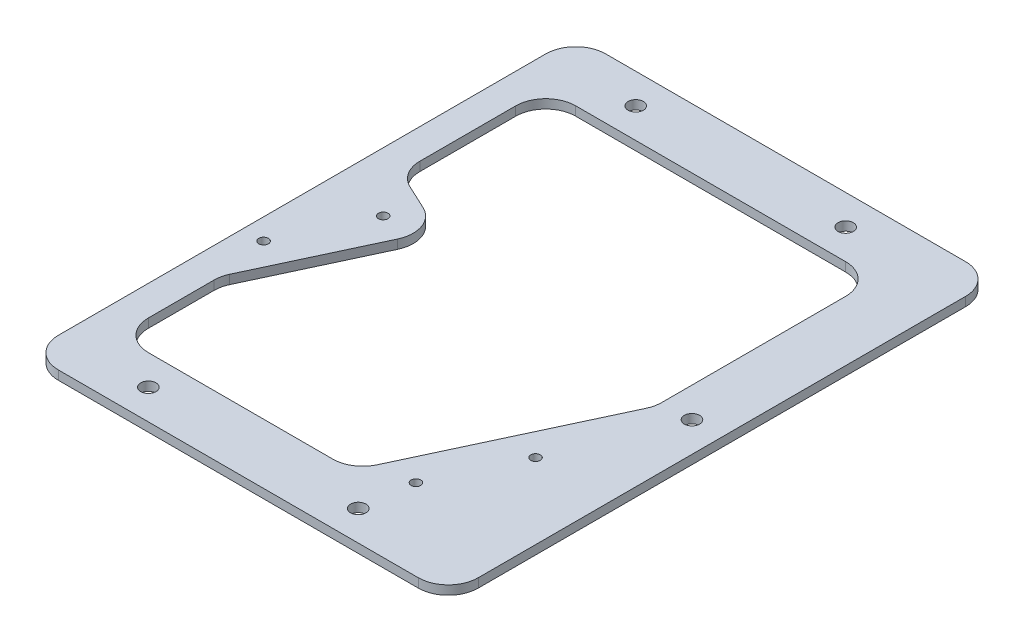
ISO-10303-21;
HEADER;
FILE_DESCRIPTION(('STEP AP214'),'2;1');
FILE_NAME('part.step','',(''),(''),'','','');
FILE_SCHEMA(('AUTOMOTIVE_DESIGN { 1 0 10303 214 1 1 1 1 }'));
ENDSEC;
DATA;
#1=APPLICATION_CONTEXT('core data for automotive mechanical design processes');
#2=APPLICATION_PROTOCOL_DEFINITION('international standard','automotive_design',2000,#1);
#3=PRODUCT_CONTEXT('',#1,'mechanical');
#4=PRODUCT('Part','Part','',(#3));
#5=PRODUCT_RELATED_PRODUCT_CATEGORY('part','',(#4));
#6=PRODUCT_DEFINITION_FORMATION('','',#4);
#7=PRODUCT_DEFINITION_CONTEXT('part definition',#1,'design');
#8=PRODUCT_DEFINITION('design','',#6,#7);
#9=PRODUCT_DEFINITION_SHAPE('','',#8);
#10=(LENGTH_UNIT() NAMED_UNIT(*) SI_UNIT(.MILLI.,.METRE.));
#11=(NAMED_UNIT(*) PLANE_ANGLE_UNIT() SI_UNIT($,.RADIAN.));
#12=(NAMED_UNIT(*) SI_UNIT($,.STERADIAN.) SOLID_ANGLE_UNIT());
#13=UNCERTAINTY_MEASURE_WITH_UNIT(LENGTH_MEASURE(1.E-05),#10,'distance_accuracy_value','');
#14=(GEOMETRIC_REPRESENTATION_CONTEXT(3) GLOBAL_UNCERTAINTY_ASSIGNED_CONTEXT((#13)) GLOBAL_UNIT_ASSIGNED_CONTEXT((#10,
#11,#12)) REPRESENTATION_CONTEXT('',''));
#15=CARTESIAN_POINT('',(0.,0.,0.));
#16=DIRECTION('',(0.,0.,1.));
#17=DIRECTION('',(1.,0.,0.));
#18=AXIS2_PLACEMENT_3D('',#15,#16,#17);
#19=CARTESIAN_POINT('',(0.,3.,0.));
#20=DIRECTION('',(0.,1.,0.));
#21=DIRECTION('',(0.,0.,1.));
#22=AXIS2_PLACEMENT_3D('',#19,#20,#21);
#23=PLANE('',#22);
#24=DIRECTION('',(-0.422618261740701,0.,0.906307787036649));
#25=VECTOR('',#24,1.);
#26=CARTESIAN_POINT('',(-60.,3.,37.0863681859172));
#27=LINE('',#26,#25);
#28=CARTESIAN_POINT('',(-41.2418848933136,3.,-3.14053947608658));
#29=VERTEX_POINT('',#28);
#30=CARTESIAN_POINT('',(-59.0630778703665,3.,35.0771321949396));
#31=VERTEX_POINT('',#30);
#32=EDGE_CURVE('E440',#29,#31,#27,.T.);
#33=ORIENTED_EDGE('',*,*,#32,.F.);
#34=CARTESIAN_POINT('',(-50.3049627636801,3.,-7.3667220934936));
#35=DIRECTION('',(0.,1.,0.));
#36=DIRECTION('',(0.,0.,1.));
#37=AXIS2_PLACEMENT_3D('',#34,#35,#36);
#38=CIRCLE('',#37,10.);
#39=CARTESIAN_POINT('',(-46.0787801462731,3.,-16.4297999638601));
#40=VERTEX_POINT('',#39);
#41=EDGE_CURVE('E320',#29,#40,#38,.T.);
#42=ORIENTED_EDGE('',*,*,#41,.T.);
#43=DIRECTION('',(0.90630778703665,0.,0.422618261740699));
#44=VECTOR('',#43,1.);
#45=CARTESIAN_POINT('',(-37.0157022759066,3.,-12.2036173464531));
#46=LINE('',#45,#44);
#47=CARTESIAN_POINT('',(-54.226182617407,3.,-20.2289961302208));
#48=VERTEX_POINT('',#47);
#49=EDGE_CURVE('E436',#48,#40,#46,.T.);
#50=ORIENTED_EDGE('',*,*,#49,.F.);
#51=CARTESIAN_POINT('',(-50.,3.,-29.2920740005873));
#52=DIRECTION('',(0.,1.,0.));
#53=DIRECTION('',(0.,0.,1.));
#54=AXIS2_PLACEMENT_3D('',#51,#52,#53);
#55=CIRCLE('',#54,10.);
#56=CARTESIAN_POINT('',(-60.0000000000001,3.,-29.2920740005873));
#57=VERTEX_POINT('',#56);
#58=EDGE_CURVE('E370',#48,#57,#55,.F.);
#59=ORIENTED_EDGE('',*,*,#58,.T.);
#60=DIRECTION('',(0.,0.,1.));
#61=VECTOR('',#60,1.);
#62=CARTESIAN_POINT('',(-60.0000000000001,3.,-22.9213713925124));
#63=LINE('',#62,#61);
#64=CARTESIAN_POINT('',(-60.,3.,-61.25));
#65=VERTEX_POINT('',#64);
#66=EDGE_CURVE('E389',#65,#57,#63,.T.);
#67=ORIENTED_EDGE('',*,*,#66,.F.);
#68=CARTESIAN_POINT('',(-50.,3.,-61.25));
#69=DIRECTION('',(0.,1.,0.));
#70=DIRECTION('',(0.,0.,1.));
#71=AXIS2_PLACEMENT_3D('',#68,#69,#70);
#72=CIRCLE('',#71,10.);
#73=CARTESIAN_POINT('',(-50.,3.,-71.25));
#74=VERTEX_POINT('',#73);
#75=EDGE_CURVE('E49',#65,#74,#72,.F.);
#76=ORIENTED_EDGE('',*,*,#75,.T.);
#77=DIRECTION('',(-1.,0.,0.));
#78=VECTOR('',#77,1.);
#79=CARTESIAN_POINT('',(-60.,3.,-71.25));
#80=LINE('',#79,#78);
#81=CARTESIAN_POINT('',(40.,3.,-71.25));
#82=VERTEX_POINT('',#81);
#83=EDGE_CURVE('E388',#82,#74,#80,.T.);
#84=ORIENTED_EDGE('',*,*,#83,.F.);
#85=CARTESIAN_POINT('',(40.,3.,-61.25));
#86=DIRECTION('',(0.,1.,0.));
#87=DIRECTION('',(0.,0.,1.));
#88=AXIS2_PLACEMENT_3D('',#85,#86,#87);
#89=CIRCLE('',#88,10.);
#90=CARTESIAN_POINT('',(50.,3.,-61.25));
#91=VERTEX_POINT('',#90);
#92=EDGE_CURVE('E376',#82,#91,#89,.F.);
#93=ORIENTED_EDGE('',*,*,#92,.T.);
#94=DIRECTION('',(0.,0.,-1.));
#95=VECTOR('',#94,1.);
#96=CARTESIAN_POINT('',(50.,3.,-71.25));
#97=LINE('',#96,#95);
#98=CARTESIAN_POINT('',(50.,3.,0.100794871398885));
#99=VERTEX_POINT('',#98);
#100=EDGE_CURVE('E399',#99,#91,#97,.T.);
#101=ORIENTED_EDGE('',*,*,#100,.F.);
#102=CARTESIAN_POINT('',(40.,3.,0.100794871398885));
#103=DIRECTION('',(0.,1.,0.));
#104=DIRECTION('',(0.,0.,1.));
#105=AXIS2_PLACEMENT_3D('',#102,#103,#104);
#106=CIRCLE('',#105,10.);
#107=CARTESIAN_POINT('',(49.0630778703665,3.,4.32697748880589));
#108=VERTEX_POINT('',#107);
#109=EDGE_CURVE('E346',#99,#108,#106,.F.);
#110=ORIENTED_EDGE('',*,*,#109,.T.);
#111=DIRECTION('',(0.422618261740701,0.,-0.906307787036649));
#112=VECTOR('',#111,1.);
#113=CARTESIAN_POINT('',(50.,3.,2.3177414978283));
#114=LINE('',#113,#112);
#115=CARTESIAN_POINT('',(20.5487352288088,3.,65.476182617407));
#116=VERTEX_POINT('',#115);
#117=EDGE_CURVE('E452',#116,#108,#114,.T.);
#118=ORIENTED_EDGE('',*,*,#117,.F.);
#119=CARTESIAN_POINT('',(11.4856573584423,3.,61.25));
#120=DIRECTION('',(0.,1.,0.));
#121=DIRECTION('',(0.,0.,1.));
#122=AXIS2_PLACEMENT_3D('',#119,#120,#121);
#123=CIRCLE('',#122,10.);
#124=CARTESIAN_POINT('',(11.4856573584423,3.,71.25));
#125=VERTEX_POINT('',#124);
#126=EDGE_CURVE('E352',#116,#125,#123,.F.);
#127=ORIENTED_EDGE('',*,*,#126,.T.);
#128=DIRECTION('',(1.,0.,0.));
#129=VECTOR('',#128,1.);
#130=CARTESIAN_POINT('',(17.8563599665172,3.,71.25));
#131=LINE('',#130,#129);
#132=CARTESIAN_POINT('',(-50.,3.,71.25));
#133=VERTEX_POINT('',#132);
#134=EDGE_CURVE('E448',#133,#125,#131,.T.);
#135=ORIENTED_EDGE('',*,*,#134,.F.);
#136=CARTESIAN_POINT('',(-50.,3.,61.25));
#137=DIRECTION('',(0.,1.,0.));
#138=DIRECTION('',(0.,0.,1.));
#139=AXIS2_PLACEMENT_3D('',#136,#137,#138);
#140=CIRCLE('',#139,10.);
#141=CARTESIAN_POINT('',(-60.0000000000001,3.,61.25));
#142=VERTEX_POINT('',#141);
#143=EDGE_CURVE('E358',#133,#142,#140,.F.);
#144=ORIENTED_EDGE('',*,*,#143,.T.);
#145=DIRECTION('',(0.,0.,1.));
#146=VECTOR('',#145,1.);
#147=CARTESIAN_POINT('',(-60.0000000000001,3.,71.25));
#148=LINE('',#147,#146);
#149=CARTESIAN_POINT('',(-60.,3.,39.3033148123466));
#150=VERTEX_POINT('',#149);
#151=EDGE_CURVE('E444',#150,#142,#148,.T.);
#152=ORIENTED_EDGE('',*,*,#151,.F.);
#153=CARTESIAN_POINT('',(-50.,3.,39.3033148123466));
#154=DIRECTION('',(0.,1.,0.));
#155=DIRECTION('',(0.,0.,1.));
#156=AXIS2_PLACEMENT_3D('',#153,#154,#155);
#157=CIRCLE('',#156,10.);
#158=EDGE_CURVE('E364',#150,#31,#157,.F.);
#159=ORIENTED_EDGE('',*,*,#158,.T.);
#160=EDGE_LOOP('',(#33,#42,#50,#59,#67,#76,#84,#93,#101,#110,#118,#127,#135,#144,#152,#159));
#161=FACE_BOUND('',#160,.T.);
#162=CARTESIAN_POINT('',(-62.9835106159011,3.,19.8225115176058));
#163=DIRECTION('',(0.,1.,0.));
#164=DIRECTION('',(0.,0.,1.));
#165=AXIS2_PLACEMENT_3D('',#162,#163,#164);
#166=CIRCLE('',#165,1.6);
#167=CARTESIAN_POINT('',(-62.9835106159011,3.,21.4225115176058));
#168=VERTEX_POINT('',#167);
#169=EDGE_CURVE('E464',#168,#168,#166,.T.);
#170=ORIENTED_EDGE('',*,*,#169,.F.);
#171=EDGE_LOOP('',(#170));
#172=FACE_BOUND('',#171,.T.);
#173=CARTESIAN_POINT('',(-50.3049627636801,3.,-7.36672209349361));
#174=DIRECTION('',(0.,1.,0.));
#175=DIRECTION('',(0.,0.,1.));
#176=AXIS2_PLACEMENT_3D('',#173,#174,#175);
#177=CIRCLE('',#176,1.60000000000006);
#178=CARTESIAN_POINT('',(-50.3049627636801,3.,-5.76672209349355));
#179=VERTEX_POINT('',#178);
#180=EDGE_CURVE('E472',#179,#179,#177,.T.);
#181=ORIENTED_EDGE('',*,*,#180,.F.);
#182=EDGE_LOOP('',(#181));
#183=FACE_BOUND('',#182,.T.);
#184=CARTESIAN_POINT('',(44.8573548751681,3.,37.0081953892799));
#185=DIRECTION('',(0.,1.,0.));
#186=DIRECTION('',(0.,0.,1.));
#187=AXIS2_PLACEMENT_3D('',#184,#185,#186);
#188=CIRCLE('',#187,1.60000000000003);
#189=CARTESIAN_POINT('',(44.8573548751681,3.,38.60819538928));
#190=VERTEX_POINT('',#189);
#191=EDGE_CURVE('E480',#190,#190,#188,.T.);
#192=ORIENTED_EDGE('',*,*,#191,.F.);
#193=EDGE_LOOP('',(#192));
#194=FACE_BOUND('',#193,.T.);
#195=CARTESIAN_POINT('',(32.1788070229471,3.,64.1974290003794));
#196=DIRECTION('',(0.,1.,0.));
#197=DIRECTION('',(0.,0.,1.));
#198=AXIS2_PLACEMENT_3D('',#195,#196,#197);
#199=CIRCLE('',#198,1.59999999999999);
#200=CARTESIAN_POINT('',(32.1788070229471,3.,65.7974290003794));
#201=VERTEX_POINT('',#200);
#202=EDGE_CURVE('E433',#201,#201,#199,.T.);
#203=ORIENTED_EDGE('',*,*,#202,.F.);
#204=EDGE_LOOP('',(#203));
#205=FACE_BOUND('',#204,.T.);
#206=CARTESIAN_POINT('',(-40.,3.,81.25));
#207=DIRECTION('',(0.,1.,0.));
#208=DIRECTION('',(0.,0.,1.));
#209=AXIS2_PLACEMENT_3D('',#206,#207,#208);
#210=CIRCLE('',#209,2.55);
#211=CARTESIAN_POINT('',(-40.,3.,83.8));
#212=VERTEX_POINT('',#211);
#213=EDGE_CURVE('E499',#212,#212,#210,.T.);
#214=ORIENTED_EDGE('',*,*,#213,.F.);
#215=EDGE_LOOP('',(#214));
#216=FACE_BOUND('',#215,.T.);
#217=CARTESIAN_POINT('',(30.,3.,-81.25));
#218=DIRECTION('',(0.,1.,0.));
#219=DIRECTION('',(0.,0.,1.));
#220=AXIS2_PLACEMENT_3D('',#217,#218,#219);
#221=CIRCLE('',#220,2.55);
#222=CARTESIAN_POINT('',(30.,3.,-78.7));
#223=VERTEX_POINT('',#222);
#224=EDGE_CURVE('E515',#223,#223,#221,.T.);
#225=ORIENTED_EDGE('',*,*,#224,.F.);
#226=EDGE_LOOP('',(#225));
#227=FACE_BOUND('',#226,.T.);
#228=DIRECTION('',(-1.,0.,0.));
#229=VECTOR('',#228,1.);
#230=CARTESIAN_POINT('',(-70.,3.,-91.25));
#231=LINE('',#230,#229);
#232=CARTESIAN_POINT('',(60.,3.,-91.25));
#233=VERTEX_POINT('',#232);
#234=CARTESIAN_POINT('',(-60.,3.,-91.25));
#235=VERTEX_POINT('',#234);
#236=EDGE_CURVE('E533',#233,#235,#231,.T.);
#237=ORIENTED_EDGE('',*,*,#236,.T.);
#238=CARTESIAN_POINT('',(-60.,3.,-81.25));
#239=DIRECTION('',(0.,1.,0.));
#240=DIRECTION('',(0.,0.,1.));
#241=AXIS2_PLACEMENT_3D('',#238,#239,#240);
#242=CIRCLE('',#241,10.);
#243=CARTESIAN_POINT('',(-70.,3.,-81.25));
#244=VERTEX_POINT('',#243);
#245=EDGE_CURVE('E268',#235,#244,#242,.T.);
#246=ORIENTED_EDGE('',*,*,#245,.T.);
#247=DIRECTION('',(0.,0.,1.));
#248=VECTOR('',#247,1.);
#249=CARTESIAN_POINT('',(-70.,3.,-91.25));
#250=LINE('',#249,#248);
#251=CARTESIAN_POINT('',(-70.,3.,81.2499999999999));
#252=VERTEX_POINT('',#251);
#253=EDGE_CURVE('E223',#244,#252,#250,.T.);
#254=ORIENTED_EDGE('',*,*,#253,.T.);
#255=CARTESIAN_POINT('',(-60.,3.,81.25));
#256=DIRECTION('',(0.,1.,0.));
#257=DIRECTION('',(0.,0.,1.));
#258=AXIS2_PLACEMENT_3D('',#255,#256,#257);
#259=CIRCLE('',#258,10.);
#260=CARTESIAN_POINT('',(-60.,3.,91.25));
#261=VERTEX_POINT('',#260);
#262=EDGE_CURVE('E262',#252,#261,#259,.T.);
#263=ORIENTED_EDGE('',*,*,#262,.T.);
#264=DIRECTION('',(1.,0.,0.));
#265=VECTOR('',#264,1.);
#266=CARTESIAN_POINT('',(-70.,3.,91.25));
#267=LINE('',#266,#265);
#268=CARTESIAN_POINT('',(60.,3.,91.25));
#269=VERTEX_POINT('',#268);
#270=EDGE_CURVE('E246',#261,#269,#267,.T.);
#271=ORIENTED_EDGE('',*,*,#270,.T.);
#272=CARTESIAN_POINT('',(60.,3.,81.25));
#273=DIRECTION('',(0.,1.,0.));
#274=DIRECTION('',(0.,0.,1.));
#275=AXIS2_PLACEMENT_3D('',#272,#273,#274);
#276=CIRCLE('',#275,10.);
#277=CARTESIAN_POINT('',(70.,3.,81.2499999999999));
#278=VERTEX_POINT('',#277);
#279=EDGE_CURVE('E259',#269,#278,#276,.T.);
#280=ORIENTED_EDGE('',*,*,#279,.T.);
#281=DIRECTION('',(0.,0.,-1.));
#282=VECTOR('',#281,1.);
#283=CARTESIAN_POINT('',(70.,3.,-91.25));
#284=LINE('',#283,#282);
#285=CARTESIAN_POINT('',(70.,3.,-81.25));
#286=VERTEX_POINT('',#285);
#287=EDGE_CURVE('E239',#278,#286,#284,.T.);
#288=ORIENTED_EDGE('',*,*,#287,.T.);
#289=CARTESIAN_POINT('',(60.,3.,-81.25));
#290=DIRECTION('',(0.,1.,0.));
#291=DIRECTION('',(0.,0.,1.));
#292=AXIS2_PLACEMENT_3D('',#289,#290,#291);
#293=CIRCLE('',#292,10.);
#294=EDGE_CURVE('E265',#286,#233,#293,.T.);
#295=ORIENTED_EDGE('',*,*,#294,.T.);
#296=EDGE_LOOP('',(#237,#246,#254,#263,#271,#280,#288,#295));
#297=FACE_BOUND('',#296,.T.);
#298=CARTESIAN_POINT('',(-40.,3.,-81.25));
#299=DIRECTION('',(0.,1.,0.));
#300=DIRECTION('',(0.,0.,1.));
#301=AXIS2_PLACEMENT_3D('',#298,#299,#300);
#302=CIRCLE('',#301,2.55);
#303=CARTESIAN_POINT('',(-40.,3.,-78.7));
#304=VERTEX_POINT('',#303);
#305=EDGE_CURVE('E523',#304,#304,#302,.T.);
#306=ORIENTED_EDGE('',*,*,#305,.F.);
#307=EDGE_LOOP('',(#306));
#308=FACE_BOUND('',#307,.T.);
#309=CARTESIAN_POINT('',(60.,3.,0.));
#310=DIRECTION('',(0.,1.,0.));
#311=DIRECTION('',(0.,0.,1.));
#312=AXIS2_PLACEMENT_3D('',#309,#310,#311);
#313=CIRCLE('',#312,2.55);
#314=CARTESIAN_POINT('',(60.,3.,2.54999999999997));
#315=VERTEX_POINT('',#314);
#316=EDGE_CURVE('E507',#315,#315,#313,.T.);
#317=ORIENTED_EDGE('',*,*,#316,.F.);
#318=EDGE_LOOP('',(#317));
#319=FACE_BOUND('',#318,.T.);
#320=CARTESIAN_POINT('',(30.,3.,81.25));
#321=DIRECTION('',(0.,1.,0.));
#322=DIRECTION('',(0.,0.,1.));
#323=AXIS2_PLACEMENT_3D('',#320,#321,#322);
#324=CIRCLE('',#323,2.55);
#325=CARTESIAN_POINT('',(30.,3.,83.8));
#326=VERTEX_POINT('',#325);
#327=EDGE_CURVE('E491',#326,#326,#324,.T.);
#328=ORIENTED_EDGE('',*,*,#327,.F.);
#329=EDGE_LOOP('',(#328));
#330=FACE_BOUND('',#329,.T.);
#331=ADVANCED_FACE('F40',(#161,#172,#183,#194,#205,#216,#227,#297,#308,#319,#330),#23,.T.);
#332=CARTESIAN_POINT('',(0.,0.,0.));
#333=DIRECTION('',(0.,1.,0.));
#334=DIRECTION('',(0.,0.,1.));
#335=AXIS2_PLACEMENT_3D('',#332,#333,#334);
#336=PLANE('',#335);
#337=DIRECTION('',(0.90630778703665,0.,0.422618261740699));
#338=VECTOR('',#337,1.);
#339=CARTESIAN_POINT('',(-37.0157022759066,0.,-12.2036173464531));
#340=LINE('',#339,#338);
#341=CARTESIAN_POINT('',(-54.226182617407,0.,-20.2289961302208));
#342=VERTEX_POINT('',#341);
#343=CARTESIAN_POINT('',(-46.0787801462731,0.,-16.4297999638601));
#344=VERTEX_POINT('',#343);
#345=EDGE_CURVE('E404',#342,#344,#340,.T.);
#346=ORIENTED_EDGE('',*,*,#345,.T.);
#347=CARTESIAN_POINT('',(-50.3049627636801,0.,-7.3667220934936));
#348=DIRECTION('',(0.,1.,0.));
#349=DIRECTION('',(0.,0.,1.));
#350=AXIS2_PLACEMENT_3D('',#347,#348,#349);
#351=CIRCLE('',#350,10.);
#352=CARTESIAN_POINT('',(-41.2418848933136,0.,-3.14053947608658));
#353=VERTEX_POINT('',#352);
#354=EDGE_CURVE('E330',#344,#353,#351,.F.);
#355=ORIENTED_EDGE('',*,*,#354,.T.);
#356=DIRECTION('',(-0.422618261740701,0.,0.906307787036649));
#357=VECTOR('',#356,1.);
#358=CARTESIAN_POINT('',(-60.,0.,37.0863681859172));
#359=LINE('',#358,#357);
#360=CARTESIAN_POINT('',(-59.0630778703665,0.,35.0771321949396));
#361=VERTEX_POINT('',#360);
#362=EDGE_CURVE('E408',#353,#361,#359,.T.);
#363=ORIENTED_EDGE('',*,*,#362,.T.);
#364=CARTESIAN_POINT('',(-50.,0.,39.3033148123466));
#365=DIRECTION('',(0.,1.,0.));
#366=DIRECTION('',(0.,0.,1.));
#367=AXIS2_PLACEMENT_3D('',#364,#365,#366);
#368=CIRCLE('',#367,10.);
#369=CARTESIAN_POINT('',(-60.,0.,39.3033148123466));
#370=VERTEX_POINT('',#369);
#371=EDGE_CURVE('E367',#361,#370,#368,.T.);
#372=ORIENTED_EDGE('',*,*,#371,.T.);
#373=DIRECTION('',(0.,0.,1.));
#374=VECTOR('',#373,1.);
#375=CARTESIAN_POINT('',(-60.0000000000001,0.,71.25));
#376=LINE('',#375,#374);
#377=CARTESIAN_POINT('',(-60.0000000000001,0.,61.25));
#378=VERTEX_POINT('',#377);
#379=EDGE_CURVE('E414',#370,#378,#376,.T.);
#380=ORIENTED_EDGE('',*,*,#379,.T.);
#381=CARTESIAN_POINT('',(-50.,0.,61.25));
#382=DIRECTION('',(0.,1.,0.));
#383=DIRECTION('',(0.,0.,1.));
#384=AXIS2_PLACEMENT_3D('',#381,#382,#383);
#385=CIRCLE('',#384,10.);
#386=CARTESIAN_POINT('',(-50.,0.,71.25));
#387=VERTEX_POINT('',#386);
#388=EDGE_CURVE('E361',#378,#387,#385,.T.);
#389=ORIENTED_EDGE('',*,*,#388,.T.);
#390=DIRECTION('',(1.,0.,0.));
#391=VECTOR('',#390,1.);
#392=CARTESIAN_POINT('',(17.8563599665172,0.,71.25));
#393=LINE('',#392,#391);
#394=CARTESIAN_POINT('',(11.4856573584423,0.,71.25));
#395=VERTEX_POINT('',#394);
#396=EDGE_CURVE('E418',#387,#395,#393,.T.);
#397=ORIENTED_EDGE('',*,*,#396,.T.);
#398=CARTESIAN_POINT('',(11.4856573584423,0.,61.25));
#399=DIRECTION('',(0.,1.,0.));
#400=DIRECTION('',(0.,0.,1.));
#401=AXIS2_PLACEMENT_3D('',#398,#399,#400);
#402=CIRCLE('',#401,10.);
#403=CARTESIAN_POINT('',(20.5487352288088,0.,65.476182617407));
#404=VERTEX_POINT('',#403);
#405=EDGE_CURVE('E355',#395,#404,#402,.T.);
#406=ORIENTED_EDGE('',*,*,#405,.T.);
#407=DIRECTION('',(0.422618261740701,0.,-0.906307787036649));
#408=VECTOR('',#407,1.);
#409=CARTESIAN_POINT('',(50.,0.,2.3177414978283));
#410=LINE('',#409,#408);
#411=CARTESIAN_POINT('',(49.0630778703665,0.,4.32697748880589));
#412=VERTEX_POINT('',#411);
#413=EDGE_CURVE('E422',#404,#412,#410,.T.);
#414=ORIENTED_EDGE('',*,*,#413,.T.);
#415=CARTESIAN_POINT('',(40.,0.,0.100794871398885));
#416=DIRECTION('',(0.,1.,0.));
#417=DIRECTION('',(0.,0.,1.));
#418=AXIS2_PLACEMENT_3D('',#415,#416,#417);
#419=CIRCLE('',#418,10.);
#420=CARTESIAN_POINT('',(50.,0.,0.100794871398885));
#421=VERTEX_POINT('',#420);
#422=EDGE_CURVE('E349',#412,#421,#419,.T.);
#423=ORIENTED_EDGE('',*,*,#422,.T.);
#424=DIRECTION('',(0.,0.,-1.));
#425=VECTOR('',#424,1.);
#426=CARTESIAN_POINT('',(50.,0.,-71.25));
#427=LINE('',#426,#425);
#428=CARTESIAN_POINT('',(50.,0.,-61.25));
#429=VERTEX_POINT('',#428);
#430=EDGE_CURVE('E426',#421,#429,#427,.T.);
#431=ORIENTED_EDGE('',*,*,#430,.T.);
#432=CARTESIAN_POINT('',(40.,0.,-61.25));
#433=DIRECTION('',(0.,1.,0.));
#434=DIRECTION('',(0.,0.,1.));
#435=AXIS2_PLACEMENT_3D('',#432,#433,#434);
#436=CIRCLE('',#435,10.);
#437=CARTESIAN_POINT('',(40.,0.,-71.25));
#438=VERTEX_POINT('',#437);
#439=EDGE_CURVE('E379',#429,#438,#436,.T.);
#440=ORIENTED_EDGE('',*,*,#439,.T.);
#441=DIRECTION('',(-1.,0.,0.));
#442=VECTOR('',#441,1.);
#443=CARTESIAN_POINT('',(-60.,0.,-71.25));
#444=LINE('',#443,#442);
#445=CARTESIAN_POINT('',(-50.,0.,-71.25));
#446=VERTEX_POINT('',#445);
#447=EDGE_CURVE('E430',#438,#446,#444,.T.);
#448=ORIENTED_EDGE('',*,*,#447,.T.);
#449=CARTESIAN_POINT('',(-50.,0.,-61.25));
#450=DIRECTION('',(0.,1.,0.));
#451=DIRECTION('',(0.,0.,1.));
#452=AXIS2_PLACEMENT_3D('',#449,#450,#451);
#453=CIRCLE('',#452,10.);
#454=CARTESIAN_POINT('',(-60.,0.,-61.25));
#455=VERTEX_POINT('',#454);
#456=EDGE_CURVE('E11',#446,#455,#453,.T.);
#457=ORIENTED_EDGE('',*,*,#456,.T.);
#458=DIRECTION('',(0.,0.,1.));
#459=VECTOR('',#458,1.);
#460=CARTESIAN_POINT('',(-60.0000000000001,0.,-22.9213713925124));
#461=LINE('',#460,#459);
#462=CARTESIAN_POINT('',(-60.0000000000001,0.,-29.2920740005873));
#463=VERTEX_POINT('',#462);
#464=EDGE_CURVE('E398',#455,#463,#461,.T.);
#465=ORIENTED_EDGE('',*,*,#464,.T.);
#466=CARTESIAN_POINT('',(-50.,0.,-29.2920740005873));
#467=DIRECTION('',(0.,1.,0.));
#468=DIRECTION('',(0.,0.,1.));
#469=AXIS2_PLACEMENT_3D('',#466,#467,#468);
#470=CIRCLE('',#469,10.);
#471=EDGE_CURVE('E373',#463,#342,#470,.T.);
#472=ORIENTED_EDGE('',*,*,#471,.T.);
#473=EDGE_LOOP('',(#346,#355,#363,#372,#380,#389,#397,#406,#414,#423,#431,#440,#448,#457,#465,#472));
#474=FACE_BOUND('',#473,.T.);
#475=CARTESIAN_POINT('',(-62.9835106159011,0.,19.8225115176058));
#476=DIRECTION('',(0.,1.,0.));
#477=DIRECTION('',(0.,0.,1.));
#478=AXIS2_PLACEMENT_3D('',#475,#476,#477);
#479=CIRCLE('',#478,1.6);
#480=CARTESIAN_POINT('',(-62.9835106159011,0.,21.4225115176058));
#481=VERTEX_POINT('',#480);
#482=EDGE_CURVE('E459',#481,#481,#479,.T.);
#483=ORIENTED_EDGE('',*,*,#482,.T.);
#484=EDGE_LOOP('',(#483));
#485=FACE_BOUND('',#484,.T.);
#486=CARTESIAN_POINT('',(-50.3049627636801,0.,-7.36672209349361));
#487=DIRECTION('',(0.,1.,0.));
#488=DIRECTION('',(0.,0.,1.));
#489=AXIS2_PLACEMENT_3D('',#486,#487,#488);
#490=CIRCLE('',#489,1.60000000000006);
#491=CARTESIAN_POINT('',(-50.3049627636801,0.,-5.76672209349355));
#492=VERTEX_POINT('',#491);
#493=EDGE_CURVE('E468',#492,#492,#490,.T.);
#494=ORIENTED_EDGE('',*,*,#493,.T.);
#495=EDGE_LOOP('',(#494));
#496=FACE_BOUND('',#495,.T.);
#497=CARTESIAN_POINT('',(44.8573548751681,0.,37.0081953892799));
#498=DIRECTION('',(0.,1.,0.));
#499=DIRECTION('',(0.,0.,1.));
#500=AXIS2_PLACEMENT_3D('',#497,#498,#499);
#501=CIRCLE('',#500,1.60000000000003);
#502=CARTESIAN_POINT('',(44.8573548751681,0.,38.60819538928));
#503=VERTEX_POINT('',#502);
#504=EDGE_CURVE('E476',#503,#503,#501,.T.);
#505=ORIENTED_EDGE('',*,*,#504,.T.);
#506=EDGE_LOOP('',(#505));
#507=FACE_BOUND('',#506,.T.);
#508=CARTESIAN_POINT('',(32.1788070229471,0.,64.1974290003794));
#509=DIRECTION('',(0.,1.,0.));
#510=DIRECTION('',(0.,0.,1.));
#511=AXIS2_PLACEMENT_3D('',#508,#509,#510);
#512=CIRCLE('',#511,1.59999999999999);
#513=CARTESIAN_POINT('',(32.1788070229471,0.,65.7974290003794));
#514=VERTEX_POINT('',#513);
#515=EDGE_CURVE('E484',#514,#514,#512,.T.);
#516=ORIENTED_EDGE('',*,*,#515,.T.);
#517=EDGE_LOOP('',(#516));
#518=FACE_BOUND('',#517,.T.);
#519=DIRECTION('',(0.,0.,1.));
#520=VECTOR('',#519,1.);
#521=CARTESIAN_POINT('',(-70.,0.,-91.25));
#522=LINE('',#521,#520);
#523=CARTESIAN_POINT('',(-70.,0.,-81.25));
#524=VERTEX_POINT('',#523);
#525=CARTESIAN_POINT('',(-70.,0.,81.2499999999999));
#526=VERTEX_POINT('',#525);
#527=EDGE_CURVE('E220',#524,#526,#522,.T.);
#528=ORIENTED_EDGE('',*,*,#527,.F.);
#529=CARTESIAN_POINT('',(-60.,0.,-81.25));
#530=DIRECTION('',(0.,1.,0.));
#531=DIRECTION('',(0.,0.,1.));
#532=AXIS2_PLACEMENT_3D('',#529,#530,#531);
#533=CIRCLE('',#532,10.);
#534=CARTESIAN_POINT('',(-60.,0.,-91.25));
#535=VERTEX_POINT('',#534);
#536=EDGE_CURVE('E202',#524,#535,#533,.F.);
#537=ORIENTED_EDGE('',*,*,#536,.T.);
#538=DIRECTION('',(-1.,0.,0.));
#539=VECTOR('',#538,1.);
#540=CARTESIAN_POINT('',(-70.,0.,-91.25));
#541=LINE('',#540,#539);
#542=CARTESIAN_POINT('',(60.,0.,-91.25));
#543=VERTEX_POINT('',#542);
#544=EDGE_CURVE('E234',#543,#535,#541,.T.);
#545=ORIENTED_EDGE('',*,*,#544,.F.);
#546=CARTESIAN_POINT('',(60.,0.,-81.25));
#547=DIRECTION('',(0.,1.,0.));
#548=DIRECTION('',(0.,0.,1.));
#549=AXIS2_PLACEMENT_3D('',#546,#547,#548);
#550=CIRCLE('',#549,10.);
#551=CARTESIAN_POINT('',(70.,0.,-81.25));
#552=VERTEX_POINT('',#551);
#553=EDGE_CURVE('E214',#543,#552,#550,.F.);
#554=ORIENTED_EDGE('',*,*,#553,.T.);
#555=DIRECTION('',(0.,0.,-1.));
#556=VECTOR('',#555,1.);
#557=CARTESIAN_POINT('',(70.,0.,-91.25));
#558=LINE('',#557,#556);
#559=CARTESIAN_POINT('',(70.,0.,81.2499999999999));
#560=VERTEX_POINT('',#559);
#561=EDGE_CURVE('E241',#560,#552,#558,.T.);
#562=ORIENTED_EDGE('',*,*,#561,.F.);
#563=CARTESIAN_POINT('',(60.,0.,81.25));
#564=DIRECTION('',(0.,1.,0.));
#565=DIRECTION('',(0.,0.,1.));
#566=AXIS2_PLACEMENT_3D('',#563,#564,#565);
#567=CIRCLE('',#566,10.);
#568=CARTESIAN_POINT('',(60.,0.,91.25));
#569=VERTEX_POINT('',#568);
#570=EDGE_CURVE('E225',#560,#569,#567,.F.);
#571=ORIENTED_EDGE('',*,*,#570,.T.);
#572=DIRECTION('',(1.,0.,0.));
#573=VECTOR('',#572,1.);
#574=CARTESIAN_POINT('',(-70.,0.,91.25));
#575=LINE('',#574,#573);
#576=CARTESIAN_POINT('',(-60.,0.,91.25));
#577=VERTEX_POINT('',#576);
#578=EDGE_CURVE('E233',#577,#569,#575,.T.);
#579=ORIENTED_EDGE('',*,*,#578,.F.);
#580=CARTESIAN_POINT('',(-60.,0.,81.25));
#581=DIRECTION('',(0.,1.,0.));
#582=DIRECTION('',(0.,0.,1.));
#583=AXIS2_PLACEMENT_3D('',#580,#581,#582);
#584=CIRCLE('',#583,10.);
#585=EDGE_CURVE('E231',#577,#526,#584,.F.);
#586=ORIENTED_EDGE('',*,*,#585,.T.);
#587=EDGE_LOOP('',(#528,#537,#545,#554,#562,#571,#579,#586));
#588=FACE_BOUND('',#587,.T.);
#589=CARTESIAN_POINT('',(-40.,0.,-81.25));
#590=DIRECTION('',(0.,1.,0.));
#591=DIRECTION('',(0.,0.,1.));
#592=AXIS2_PLACEMENT_3D('',#589,#590,#591);
#593=CIRCLE('',#592,2.55);
#594=CARTESIAN_POINT('',(-40.,0.,-78.7));
#595=VERTEX_POINT('',#594);
#596=EDGE_CURVE('E519',#595,#595,#593,.T.);
#597=ORIENTED_EDGE('',*,*,#596,.T.);
#598=EDGE_LOOP('',(#597));
#599=FACE_BOUND('',#598,.T.);
#600=CARTESIAN_POINT('',(30.,0.,-81.25));
#601=DIRECTION('',(0.,1.,0.));
#602=DIRECTION('',(0.,0.,1.));
#603=AXIS2_PLACEMENT_3D('',#600,#601,#602);
#604=CIRCLE('',#603,2.55);
#605=CARTESIAN_POINT('',(30.,0.,-78.7));
#606=VERTEX_POINT('',#605);
#607=EDGE_CURVE('E511',#606,#606,#604,.T.);
#608=ORIENTED_EDGE('',*,*,#607,.T.);
#609=EDGE_LOOP('',(#608));
#610=FACE_BOUND('',#609,.T.);
#611=CARTESIAN_POINT('',(60.,0.,0.));
#612=DIRECTION('',(0.,1.,0.));
#613=DIRECTION('',(0.,0.,1.));
#614=AXIS2_PLACEMENT_3D('',#611,#612,#613);
#615=CIRCLE('',#614,2.55);
#616=CARTESIAN_POINT('',(60.,0.,2.54999999999997));
#617=VERTEX_POINT('',#616);
#618=EDGE_CURVE('E503',#617,#617,#615,.T.);
#619=ORIENTED_EDGE('',*,*,#618,.T.);
#620=EDGE_LOOP('',(#619));
#621=FACE_BOUND('',#620,.T.);
#622=CARTESIAN_POINT('',(-40.,0.,81.25));
#623=DIRECTION('',(0.,1.,0.));
#624=DIRECTION('',(0.,0.,1.));
#625=AXIS2_PLACEMENT_3D('',#622,#623,#624);
#626=CIRCLE('',#625,2.55);
#627=CARTESIAN_POINT('',(-40.,0.,83.8));
#628=VERTEX_POINT('',#627);
#629=EDGE_CURVE('E495',#628,#628,#626,.T.);
#630=ORIENTED_EDGE('',*,*,#629,.T.);
#631=EDGE_LOOP('',(#630));
#632=FACE_BOUND('',#631,.T.);
#633=CARTESIAN_POINT('',(30.,0.,81.25));
#634=DIRECTION('',(0.,1.,0.));
#635=DIRECTION('',(0.,0.,1.));
#636=AXIS2_PLACEMENT_3D('',#633,#634,#635);
#637=CIRCLE('',#636,2.55);
#638=CARTESIAN_POINT('',(30.,0.,83.8));
#639=VERTEX_POINT('',#638);
#640=EDGE_CURVE('E463',#639,#639,#637,.T.);
#641=ORIENTED_EDGE('',*,*,#640,.T.);
#642=EDGE_LOOP('',(#641));
#643=FACE_BOUND('',#642,.T.);
#644=ADVANCED_FACE('F228',(#474,#485,#496,#507,#518,#588,#599,#610,#621,#632,#643),#336,.F.);
#645=CARTESIAN_POINT('',(70.,3.,-91.25));
#646=DIRECTION('',(-1.,0.,0.));
#647=DIRECTION('',(0.,0.,1.));
#648=AXIS2_PLACEMENT_3D('',#645,#646,#647);
#649=PLANE('',#648);
#650=ORIENTED_EDGE('',*,*,#561,.T.);
#651=DIRECTION('',(0.,-1.,0.));
#652=VECTOR('',#651,1.);
#653=CARTESIAN_POINT('',(70.,3.,-81.25));
#654=LINE('',#653,#652);
#655=EDGE_CURVE('E275',#552,#286,#654,.F.);
#656=ORIENTED_EDGE('',*,*,#655,.T.);
#657=ORIENTED_EDGE('',*,*,#287,.F.);
#658=DIRECTION('',(0.,-1.,0.));
#659=VECTOR('',#658,1.);
#660=CARTESIAN_POINT('',(70.,3.,81.25));
#661=LINE('',#660,#659);
#662=EDGE_CURVE('E271',#278,#560,#661,.T.);
#663=ORIENTED_EDGE('',*,*,#662,.T.);
#664=EDGE_LOOP('',(#650,#656,#657,#663));
#665=FACE_BOUND('',#664,.T.);
#666=ADVANCED_FACE('F546',(#665),#649,.F.);
#667=CARTESIAN_POINT('',(-70.,3.,-91.25));
#668=DIRECTION('',(0.,0.,1.));
#669=DIRECTION('',(1.,0.,0.));
#670=AXIS2_PLACEMENT_3D('',#667,#668,#669);
#671=PLANE('',#670);
#672=ORIENTED_EDGE('',*,*,#544,.T.);
#673=DIRECTION('',(0.,-1.,0.));
#674=VECTOR('',#673,1.);
#675=CARTESIAN_POINT('',(-60.,3.,-91.25));
#676=LINE('',#675,#674);
#677=EDGE_CURVE('E207',#535,#235,#676,.F.);
#678=ORIENTED_EDGE('',*,*,#677,.T.);
#679=ORIENTED_EDGE('',*,*,#236,.F.);
#680=DIRECTION('',(0.,-1.,0.));
#681=VECTOR('',#680,1.);
#682=CARTESIAN_POINT('',(60.,3.,-91.25));
#683=LINE('',#682,#681);
#684=EDGE_CURVE('E213',#233,#543,#683,.T.);
#685=ORIENTED_EDGE('',*,*,#684,.T.);
#686=EDGE_LOOP('',(#672,#678,#679,#685));
#687=FACE_BOUND('',#686,.T.);
#688=ADVANCED_FACE('F557',(#687),#671,.F.);
#689=CARTESIAN_POINT('',(-70.,3.,-91.25));
#690=DIRECTION('',(1.,0.,0.));
#691=DIRECTION('',(0.,0.,-1.));
#692=AXIS2_PLACEMENT_3D('',#689,#690,#691);
#693=PLANE('',#692);
#694=ORIENTED_EDGE('',*,*,#253,.F.);
#695=DIRECTION('',(0.,-1.,0.));
#696=VECTOR('',#695,1.);
#697=CARTESIAN_POINT('',(-70.,3.,-81.25));
#698=LINE('',#697,#696);
#699=EDGE_CURVE('E206',#244,#524,#698,.T.);
#700=ORIENTED_EDGE('',*,*,#699,.T.);
#701=ORIENTED_EDGE('',*,*,#527,.T.);
#702=DIRECTION('',(0.,-1.,0.));
#703=VECTOR('',#702,1.);
#704=CARTESIAN_POINT('',(-70.,3.,81.25));
#705=LINE('',#704,#703);
#706=EDGE_CURVE('E226',#526,#252,#705,.F.);
#707=ORIENTED_EDGE('',*,*,#706,.T.);
#708=EDGE_LOOP('',(#694,#700,#701,#707));
#709=FACE_BOUND('',#708,.T.);
#710=ADVANCED_FACE('F219',(#709),#693,.F.);
#711=CARTESIAN_POINT('',(-70.,3.,91.25));
#712=DIRECTION('',(0.,0.,-1.));
#713=DIRECTION('',(-1.,0.,0.));
#714=AXIS2_PLACEMENT_3D('',#711,#712,#713);
#715=PLANE('',#714);
#716=ORIENTED_EDGE('',*,*,#270,.F.);
#717=DIRECTION('',(0.,-1.,0.));
#718=VECTOR('',#717,1.);
#719=CARTESIAN_POINT('',(-60.,3.,91.25));
#720=LINE('',#719,#718);
#721=EDGE_CURVE('E281',#261,#577,#720,.T.);
#722=ORIENTED_EDGE('',*,*,#721,.T.);
#723=ORIENTED_EDGE('',*,*,#578,.T.);
#724=DIRECTION('',(0.,-1.,0.));
#725=VECTOR('',#724,1.);
#726=CARTESIAN_POINT('',(60.,3.,91.25));
#727=LINE('',#726,#725);
#728=EDGE_CURVE('E278',#569,#269,#727,.F.);
#729=ORIENTED_EDGE('',*,*,#728,.T.);
#730=EDGE_LOOP('',(#716,#722,#723,#729));
#731=FACE_BOUND('',#730,.T.);
#732=ADVANCED_FACE('F564',(#731),#715,.F.);
#733=CARTESIAN_POINT('',(-40.,3.,-81.25));
#734=DIRECTION('',(0.,-1.,0.));
#735=DIRECTION('',(0.,0.,-1.));
#736=AXIS2_PLACEMENT_3D('',#733,#734,#735);
#737=CYLINDRICAL_SURFACE('',#736,2.55);
#738=ORIENTED_EDGE('',*,*,#305,.T.);
#739=EDGE_LOOP('',(#738));
#740=FACE_BOUND('',#739,.T.);
#741=ORIENTED_EDGE('',*,*,#596,.F.);
#742=EDGE_LOOP('',(#741));
#743=FACE_BOUND('',#742,.T.);
#744=ADVANCED_FACE('F575',(#740,#743),#737,.F.);
#745=CARTESIAN_POINT('',(30.,3.,-81.25));
#746=DIRECTION('',(0.,-1.,0.));
#747=DIRECTION('',(0.,0.,-1.));
#748=AXIS2_PLACEMENT_3D('',#745,#746,#747);
#749=CYLINDRICAL_SURFACE('',#748,2.55);
#750=ORIENTED_EDGE('',*,*,#224,.T.);
#751=EDGE_LOOP('',(#750));
#752=FACE_BOUND('',#751,.T.);
#753=ORIENTED_EDGE('',*,*,#607,.F.);
#754=EDGE_LOOP('',(#753));
#755=FACE_BOUND('',#754,.T.);
#756=ADVANCED_FACE('F584',(#752,#755),#749,.F.);
#757=CARTESIAN_POINT('',(60.,3.,0.));
#758=DIRECTION('',(0.,-1.,0.));
#759=DIRECTION('',(0.,0.,-1.));
#760=AXIS2_PLACEMENT_3D('',#757,#758,#759);
#761=CYLINDRICAL_SURFACE('',#760,2.55);
#762=ORIENTED_EDGE('',*,*,#316,.T.);
#763=EDGE_LOOP('',(#762));
#764=FACE_BOUND('',#763,.T.);
#765=ORIENTED_EDGE('',*,*,#618,.F.);
#766=EDGE_LOOP('',(#765));
#767=FACE_BOUND('',#766,.T.);
#768=ADVANCED_FACE('F709',(#764,#767),#761,.F.);
#769=CARTESIAN_POINT('',(-40.,3.,81.25));
#770=DIRECTION('',(0.,-1.,0.));
#771=DIRECTION('',(0.,0.,-1.));
#772=AXIS2_PLACEMENT_3D('',#769,#770,#771);
#773=CYLINDRICAL_SURFACE('',#772,2.55);
#774=ORIENTED_EDGE('',*,*,#213,.T.);
#775=EDGE_LOOP('',(#774));
#776=FACE_BOUND('',#775,.T.);
#777=ORIENTED_EDGE('',*,*,#629,.F.);
#778=EDGE_LOOP('',(#777));
#779=FACE_BOUND('',#778,.T.);
#780=ADVANCED_FACE('F705',(#776,#779),#773,.F.);
#781=CARTESIAN_POINT('',(30.,3.,81.25));
#782=DIRECTION('',(0.,-1.,0.));
#783=DIRECTION('',(0.,0.,-1.));
#784=AXIS2_PLACEMENT_3D('',#781,#782,#783);
#785=CYLINDRICAL_SURFACE('',#784,2.55);
#786=ORIENTED_EDGE('',*,*,#327,.T.);
#787=EDGE_LOOP('',(#786));
#788=FACE_BOUND('',#787,.T.);
#789=ORIENTED_EDGE('',*,*,#640,.F.);
#790=EDGE_LOOP('',(#789));
#791=FACE_BOUND('',#790,.T.);
#792=ADVANCED_FACE('F702',(#788,#791),#785,.F.);
#793=CARTESIAN_POINT('',(-60.,3.,-81.25));
#794=DIRECTION('',(0.,-1.,0.));
#795=DIRECTION('',(0.,0.,-1.));
#796=AXIS2_PLACEMENT_3D('',#793,#794,#795);
#797=CYLINDRICAL_SURFACE('',#796,10.);
#798=ORIENTED_EDGE('',*,*,#245,.F.);
#799=ORIENTED_EDGE('',*,*,#677,.F.);
#800=ORIENTED_EDGE('',*,*,#536,.F.);
#801=ORIENTED_EDGE('',*,*,#699,.F.);
#802=EDGE_LOOP('',(#798,#799,#800,#801));
#803=FACE_BOUND('',#802,.T.);
#804=ADVANCED_FACE('F205',(#803),#797,.T.);
#805=CARTESIAN_POINT('',(60.,3.,-81.25));
#806=DIRECTION('',(0.,-1.,0.));
#807=DIRECTION('',(0.,0.,-1.));
#808=AXIS2_PLACEMENT_3D('',#805,#806,#807);
#809=CYLINDRICAL_SURFACE('',#808,10.);
#810=ORIENTED_EDGE('',*,*,#294,.F.);
#811=ORIENTED_EDGE('',*,*,#655,.F.);
#812=ORIENTED_EDGE('',*,*,#553,.F.);
#813=ORIENTED_EDGE('',*,*,#684,.F.);
#814=EDGE_LOOP('',(#810,#811,#812,#813));
#815=FACE_BOUND('',#814,.T.);
#816=ADVANCED_FACE('F551',(#815),#809,.T.);
#817=CARTESIAN_POINT('',(-60.,3.,81.25));
#818=DIRECTION('',(0.,-1.,0.));
#819=DIRECTION('',(0.,0.,-1.));
#820=AXIS2_PLACEMENT_3D('',#817,#818,#819);
#821=CYLINDRICAL_SURFACE('',#820,10.);
#822=ORIENTED_EDGE('',*,*,#262,.F.);
#823=ORIENTED_EDGE('',*,*,#706,.F.);
#824=ORIENTED_EDGE('',*,*,#585,.F.);
#825=ORIENTED_EDGE('',*,*,#721,.F.);
#826=EDGE_LOOP('',(#822,#823,#824,#825));
#827=FACE_BOUND('',#826,.T.);
#828=ADVANCED_FACE('F592',(#827),#821,.T.);
#829=CARTESIAN_POINT('',(60.,3.,81.25));
#830=DIRECTION('',(0.,-1.,0.));
#831=DIRECTION('',(0.,0.,-1.));
#832=AXIS2_PLACEMENT_3D('',#829,#830,#831);
#833=CYLINDRICAL_SURFACE('',#832,10.);
#834=ORIENTED_EDGE('',*,*,#279,.F.);
#835=ORIENTED_EDGE('',*,*,#728,.F.);
#836=ORIENTED_EDGE('',*,*,#570,.F.);
#837=ORIENTED_EDGE('',*,*,#662,.F.);
#838=EDGE_LOOP('',(#834,#835,#836,#837));
#839=FACE_BOUND('',#838,.T.);
#840=ADVANCED_FACE('F594',(#839),#833,.T.);
#841=CARTESIAN_POINT('',(32.1788070229471,0.,64.1974290003794));
#842=DIRECTION('',(0.,1.,0.));
#843=DIRECTION('',(0.,0.,1.));
#844=AXIS2_PLACEMENT_3D('',#841,#842,#843);
#845=CYLINDRICAL_SURFACE('',#844,1.59999999999999);
#846=ORIENTED_EDGE('',*,*,#515,.F.);
#847=EDGE_LOOP('',(#846));
#848=FACE_BOUND('',#847,.T.);
#849=ORIENTED_EDGE('',*,*,#202,.T.);
#850=EDGE_LOOP('',(#849));
#851=FACE_BOUND('',#850,.T.);
#852=ADVANCED_FACE('F600',(#848,#851),#845,.F.);
#853=CARTESIAN_POINT('',(44.8573548751681,0.,37.0081953892799));
#854=DIRECTION('',(0.,1.,0.));
#855=DIRECTION('',(0.,0.,1.));
#856=AXIS2_PLACEMENT_3D('',#853,#854,#855);
#857=CYLINDRICAL_SURFACE('',#856,1.60000000000003);
#858=ORIENTED_EDGE('',*,*,#504,.F.);
#859=EDGE_LOOP('',(#858));
#860=FACE_BOUND('',#859,.T.);
#861=ORIENTED_EDGE('',*,*,#191,.T.);
#862=EDGE_LOOP('',(#861));
#863=FACE_BOUND('',#862,.T.);
#864=ADVANCED_FACE('F694',(#860,#863),#857,.F.);
#865=CARTESIAN_POINT('',(-50.3049627636801,0.,-7.36672209349361));
#866=DIRECTION('',(0.,1.,0.));
#867=DIRECTION('',(0.,0.,1.));
#868=AXIS2_PLACEMENT_3D('',#865,#866,#867);
#869=CYLINDRICAL_SURFACE('',#868,1.60000000000006);
#870=ORIENTED_EDGE('',*,*,#493,.F.);
#871=EDGE_LOOP('',(#870));
#872=FACE_BOUND('',#871,.T.);
#873=ORIENTED_EDGE('',*,*,#180,.T.);
#874=EDGE_LOOP('',(#873));
#875=FACE_BOUND('',#874,.T.);
#876=ADVANCED_FACE('F690',(#872,#875),#869,.F.);
#877=CARTESIAN_POINT('',(-62.9835106159011,0.,19.8225115176058));
#878=DIRECTION('',(0.,1.,0.));
#879=DIRECTION('',(0.,0.,1.));
#880=AXIS2_PLACEMENT_3D('',#877,#878,#879);
#881=CYLINDRICAL_SURFACE('',#880,1.6);
#882=ORIENTED_EDGE('',*,*,#482,.F.);
#883=EDGE_LOOP('',(#882));
#884=FACE_BOUND('',#883,.T.);
#885=ORIENTED_EDGE('',*,*,#169,.T.);
#886=EDGE_LOOP('',(#885));
#887=FACE_BOUND('',#886,.T.);
#888=ADVANCED_FACE('F687',(#884,#887),#881,.F.);
#889=CARTESIAN_POINT('',(-60.0000000000001,0.,-22.9213713925124));
#890=DIRECTION('',(-1.,0.,0.));
#891=DIRECTION('',(0.,0.,1.));
#892=AXIS2_PLACEMENT_3D('',#889,#890,#891);
#893=PLANE('',#892);
#894=ORIENTED_EDGE('',*,*,#66,.T.);
#895=DIRECTION('',(0.,1.,0.));
#896=VECTOR('',#895,1.);
#897=CARTESIAN_POINT('',(-60.0000000000001,0.,-29.2920740005873));
#898=LINE('',#897,#896);
#899=EDGE_CURVE('E56',#57,#463,#898,.F.);
#900=ORIENTED_EDGE('',*,*,#899,.T.);
#901=ORIENTED_EDGE('',*,*,#464,.F.);
#902=DIRECTION('',(0.,1.,0.));
#903=VECTOR('',#902,1.);
#904=CARTESIAN_POINT('',(-60.,3.,-61.25));
#905=LINE('',#904,#903);
#906=EDGE_CURVE('E333',#455,#65,#905,.T.);
#907=ORIENTED_EDGE('',*,*,#906,.T.);
#908=EDGE_LOOP('',(#894,#900,#901,#907));
#909=FACE_BOUND('',#908,.T.);
#910=ADVANCED_FACE('F401',(#909),#893,.F.);
#911=CARTESIAN_POINT('',(-60.,0.,-71.25));
#912=DIRECTION('',(0.,0.,-1.));
#913=DIRECTION('',(-1.,0.,0.));
#914=AXIS2_PLACEMENT_3D('',#911,#912,#913);
#915=PLANE('',#914);
#916=ORIENTED_EDGE('',*,*,#447,.F.);
#917=DIRECTION('',(0.,1.,0.));
#918=VECTOR('',#917,1.);
#919=CARTESIAN_POINT('',(40.,3.,-71.25));
#920=LINE('',#919,#918);
#921=EDGE_CURVE('E342',#438,#82,#920,.T.);
#922=ORIENTED_EDGE('',*,*,#921,.T.);
#923=ORIENTED_EDGE('',*,*,#83,.T.);
#924=DIRECTION('',(0.,1.,0.));
#925=VECTOR('',#924,1.);
#926=CARTESIAN_POINT('',(-50.,0.,-71.25));
#927=LINE('',#926,#925);
#928=EDGE_CURVE('E339',#74,#446,#927,.F.);
#929=ORIENTED_EDGE('',*,*,#928,.T.);
#930=EDGE_LOOP('',(#916,#922,#923,#929));
#931=FACE_BOUND('',#930,.T.);
#932=ADVANCED_FACE('F395',(#931),#915,.F.);
#933=CARTESIAN_POINT('',(50.,0.,-71.25));
#934=DIRECTION('',(1.,0.,0.));
#935=DIRECTION('',(0.,0.,-1.));
#936=AXIS2_PLACEMENT_3D('',#933,#934,#935);
#937=PLANE('',#936);
#938=ORIENTED_EDGE('',*,*,#430,.F.);
#939=DIRECTION('',(0.,1.,0.));
#940=VECTOR('',#939,1.);
#941=CARTESIAN_POINT('',(50.,3.,0.100794871398884));
#942=LINE('',#941,#940);
#943=EDGE_CURVE('E288',#421,#99,#942,.T.);
#944=ORIENTED_EDGE('',*,*,#943,.T.);
#945=ORIENTED_EDGE('',*,*,#100,.T.);
#946=DIRECTION('',(0.,1.,0.));
#947=VECTOR('',#946,1.);
#948=CARTESIAN_POINT('',(50.,0.,-61.25));
#949=LINE('',#948,#947);
#950=EDGE_CURVE('E285',#91,#429,#949,.F.);
#951=ORIENTED_EDGE('',*,*,#950,.T.);
#952=EDGE_LOOP('',(#938,#944,#945,#951));
#953=FACE_BOUND('',#952,.T.);
#954=ADVANCED_FACE('F643',(#953),#937,.F.);
#955=CARTESIAN_POINT('',(50.,0.,2.3177414978283));
#956=DIRECTION('',(0.906307787036649,0.,0.422618261740701));
#957=DIRECTION('',(0.422618261740701,0.,-0.906307787036649));
#958=AXIS2_PLACEMENT_3D('',#955,#956,#957);
#959=PLANE('',#958);
#960=ORIENTED_EDGE('',*,*,#117,.T.);
#961=DIRECTION('',(0.,1.,0.));
#962=VECTOR('',#961,1.);
#963=CARTESIAN_POINT('',(49.0630778703665,0.,4.32697748880589));
#964=LINE('',#963,#962);
#965=EDGE_CURVE('E296',#108,#412,#964,.F.);
#966=ORIENTED_EDGE('',*,*,#965,.T.);
#967=ORIENTED_EDGE('',*,*,#413,.F.);
#968=DIRECTION('',(0.,1.,0.));
#969=VECTOR('',#968,1.);
#970=CARTESIAN_POINT('',(20.5487352288088,3.,65.476182617407));
#971=LINE('',#970,#969);
#972=EDGE_CURVE('E292',#404,#116,#971,.T.);
#973=ORIENTED_EDGE('',*,*,#972,.T.);
#974=EDGE_LOOP('',(#960,#966,#967,#973));
#975=FACE_BOUND('',#974,.T.);
#976=ADVANCED_FACE('F648',(#975),#959,.F.);
#977=CARTESIAN_POINT('',(17.8563599665172,0.,71.25));
#978=DIRECTION('',(0.,0.,1.));
#979=DIRECTION('',(1.,0.,0.));
#980=AXIS2_PLACEMENT_3D('',#977,#978,#979);
#981=PLANE('',#980);
#982=ORIENTED_EDGE('',*,*,#134,.T.);
#983=DIRECTION('',(0.,1.,0.));
#984=VECTOR('',#983,1.);
#985=CARTESIAN_POINT('',(11.4856573584423,0.,71.25));
#986=LINE('',#985,#984);
#987=EDGE_CURVE('E303',#125,#395,#986,.F.);
#988=ORIENTED_EDGE('',*,*,#987,.T.);
#989=ORIENTED_EDGE('',*,*,#396,.F.);
#990=DIRECTION('',(0.,1.,0.));
#991=VECTOR('',#990,1.);
#992=CARTESIAN_POINT('',(-50.,3.,71.25));
#993=LINE('',#992,#991);
#994=EDGE_CURVE('E299',#387,#133,#993,.T.);
#995=ORIENTED_EDGE('',*,*,#994,.T.);
#996=EDGE_LOOP('',(#982,#988,#989,#995));
#997=FACE_BOUND('',#996,.T.);
#998=ADVANCED_FACE('F655',(#997),#981,.F.);
#999=CARTESIAN_POINT('',(-60.0000000000001,0.,71.25));
#1000=DIRECTION('',(-1.,0.,0.));
#1001=DIRECTION('',(0.,0.,1.));
#1002=AXIS2_PLACEMENT_3D('',#999,#1000,#1001);
#1003=PLANE('',#1002);
#1004=ORIENTED_EDGE('',*,*,#151,.T.);
#1005=DIRECTION('',(0.,1.,0.));
#1006=VECTOR('',#1005,1.);
#1007=CARTESIAN_POINT('',(-60.0000000000001,0.,61.25));
#1008=LINE('',#1007,#1006);
#1009=EDGE_CURVE('E310',#142,#378,#1008,.F.);
#1010=ORIENTED_EDGE('',*,*,#1009,.T.);
#1011=ORIENTED_EDGE('',*,*,#379,.F.);
#1012=DIRECTION('',(0.,1.,0.));
#1013=VECTOR('',#1012,1.);
#1014=CARTESIAN_POINT('',(-60.,3.,39.3033148123466));
#1015=LINE('',#1014,#1013);
#1016=EDGE_CURVE('E306',#370,#150,#1015,.T.);
#1017=ORIENTED_EDGE('',*,*,#1016,.T.);
#1018=EDGE_LOOP('',(#1004,#1010,#1011,#1017));
#1019=FACE_BOUND('',#1018,.T.);
#1020=ADVANCED_FACE('F662',(#1019),#1003,.F.);
#1021=CARTESIAN_POINT('',(-60.,0.,37.0863681859172));
#1022=DIRECTION('',(-0.906307787036649,0.,-0.422618261740701));
#1023=DIRECTION('',(-0.422618261740701,0.,0.906307787036649));
#1024=AXIS2_PLACEMENT_3D('',#1021,#1022,#1023);
#1025=PLANE('',#1024);
#1026=ORIENTED_EDGE('',*,*,#32,.T.);
#1027=DIRECTION('',(0.,1.,0.));
#1028=VECTOR('',#1027,1.);
#1029=CARTESIAN_POINT('',(-59.0630778703665,0.,35.0771321949396));
#1030=LINE('',#1029,#1028);
#1031=EDGE_CURVE('E317',#31,#361,#1030,.F.);
#1032=ORIENTED_EDGE('',*,*,#1031,.T.);
#1033=ORIENTED_EDGE('',*,*,#362,.F.);
#1034=DIRECTION('',(0.,1.,0.));
#1035=VECTOR('',#1034,1.);
#1036=CARTESIAN_POINT('',(-41.2418848933136,0.,-3.1405394760866));
#1037=LINE('',#1036,#1035);
#1038=EDGE_CURVE('E313',#353,#29,#1037,.T.);
#1039=ORIENTED_EDGE('',*,*,#1038,.T.);
#1040=EDGE_LOOP('',(#1026,#1032,#1033,#1039));
#1041=FACE_BOUND('',#1040,.T.);
#1042=ADVANCED_FACE('F668',(#1041),#1025,.F.);
#1043=CARTESIAN_POINT('',(-37.0157022759066,0.,-12.2036173464531));
#1044=DIRECTION('',(-0.422618261740699,0.,0.90630778703665));
#1045=DIRECTION('',(0.90630778703665,0.,0.422618261740699));
#1046=AXIS2_PLACEMENT_3D('',#1043,#1044,#1045);
#1047=PLANE('',#1046);
#1048=ORIENTED_EDGE('',*,*,#49,.T.);
#1049=DIRECTION('',(0.,1.,0.));
#1050=VECTOR('',#1049,1.);
#1051=CARTESIAN_POINT('',(-46.0787801462731,0.,-16.4297999638601));
#1052=LINE('',#1051,#1050);
#1053=EDGE_CURVE('E327',#40,#344,#1052,.F.);
#1054=ORIENTED_EDGE('',*,*,#1053,.T.);
#1055=ORIENTED_EDGE('',*,*,#345,.F.);
#1056=DIRECTION('',(0.,1.,0.));
#1057=VECTOR('',#1056,1.);
#1058=CARTESIAN_POINT('',(-54.226182617407,3.,-20.2289961302208));
#1059=LINE('',#1058,#1057);
#1060=EDGE_CURVE('E323',#342,#48,#1059,.T.);
#1061=ORIENTED_EDGE('',*,*,#1060,.T.);
#1062=EDGE_LOOP('',(#1048,#1054,#1055,#1061));
#1063=FACE_BOUND('',#1062,.T.);
#1064=ADVANCED_FACE('F610',(#1063),#1047,.F.);
#1065=CARTESIAN_POINT('',(40.,0.,0.100794871398885));
#1066=DIRECTION('',(0.,-1.,0.));
#1067=DIRECTION('',(0.,0.,-1.));
#1068=AXIS2_PLACEMENT_3D('',#1065,#1066,#1067);
#1069=CYLINDRICAL_SURFACE('',#1068,10.);
#1070=ORIENTED_EDGE('',*,*,#422,.F.);
#1071=ORIENTED_EDGE('',*,*,#965,.F.);
#1072=ORIENTED_EDGE('',*,*,#109,.F.);
#1073=ORIENTED_EDGE('',*,*,#943,.F.);
#1074=EDGE_LOOP('',(#1070,#1071,#1072,#1073));
#1075=FACE_BOUND('',#1074,.T.);
#1076=ADVANCED_FACE('F606',(#1075),#1069,.F.);
#1077=CARTESIAN_POINT('',(11.4856573584423,0.,61.25));
#1078=DIRECTION('',(0.,-1.,0.));
#1079=DIRECTION('',(0.,0.,-1.));
#1080=AXIS2_PLACEMENT_3D('',#1077,#1078,#1079);
#1081=CYLINDRICAL_SURFACE('',#1080,10.);
#1082=ORIENTED_EDGE('',*,*,#405,.F.);
#1083=ORIENTED_EDGE('',*,*,#987,.F.);
#1084=ORIENTED_EDGE('',*,*,#126,.F.);
#1085=ORIENTED_EDGE('',*,*,#972,.F.);
#1086=EDGE_LOOP('',(#1082,#1083,#1084,#1085));
#1087=FACE_BOUND('',#1086,.T.);
#1088=ADVANCED_FACE('F609',(#1087),#1081,.F.);
#1089=CARTESIAN_POINT('',(-50.,0.,61.25));
#1090=DIRECTION('',(0.,-1.,0.));
#1091=DIRECTION('',(0.,0.,-1.));
#1092=AXIS2_PLACEMENT_3D('',#1089,#1090,#1091);
#1093=CYLINDRICAL_SURFACE('',#1092,10.);
#1094=ORIENTED_EDGE('',*,*,#388,.F.);
#1095=ORIENTED_EDGE('',*,*,#1009,.F.);
#1096=ORIENTED_EDGE('',*,*,#143,.F.);
#1097=ORIENTED_EDGE('',*,*,#994,.F.);
#1098=EDGE_LOOP('',(#1094,#1095,#1096,#1097));
#1099=FACE_BOUND('',#1098,.T.);
#1100=ADVANCED_FACE('F614',(#1099),#1093,.F.);
#1101=CARTESIAN_POINT('',(-50.,0.,39.3033148123466));
#1102=DIRECTION('',(0.,-1.,0.));
#1103=DIRECTION('',(0.,0.,-1.));
#1104=AXIS2_PLACEMENT_3D('',#1101,#1102,#1103);
#1105=CYLINDRICAL_SURFACE('',#1104,10.);
#1106=ORIENTED_EDGE('',*,*,#371,.F.);
#1107=ORIENTED_EDGE('',*,*,#1031,.F.);
#1108=ORIENTED_EDGE('',*,*,#158,.F.);
#1109=ORIENTED_EDGE('',*,*,#1016,.F.);
#1110=EDGE_LOOP('',(#1106,#1107,#1108,#1109));
#1111=FACE_BOUND('',#1110,.T.);
#1112=ADVANCED_FACE('F618',(#1111),#1105,.F.);
#1113=CARTESIAN_POINT('',(-50.3049627636801,0.,-7.3667220934936));
#1114=DIRECTION('',(0.,1.,0.));
#1115=DIRECTION('',(0.,0.,1.));
#1116=AXIS2_PLACEMENT_3D('',#1113,#1114,#1115);
#1117=CYLINDRICAL_SURFACE('',#1116,10.);
#1118=ORIENTED_EDGE('',*,*,#354,.F.);
#1119=ORIENTED_EDGE('',*,*,#1053,.F.);
#1120=ORIENTED_EDGE('',*,*,#41,.F.);
#1121=ORIENTED_EDGE('',*,*,#1038,.F.);
#1122=EDGE_LOOP('',(#1118,#1119,#1120,#1121));
#1123=FACE_BOUND('',#1122,.T.);
#1124=ADVANCED_FACE('F622',(#1123),#1117,.T.);
#1125=CARTESIAN_POINT('',(-50.,0.,-29.2920740005873));
#1126=DIRECTION('',(0.,-1.,0.));
#1127=DIRECTION('',(0.,0.,-1.));
#1128=AXIS2_PLACEMENT_3D('',#1125,#1126,#1127);
#1129=CYLINDRICAL_SURFACE('',#1128,10.);
#1130=ORIENTED_EDGE('',*,*,#471,.F.);
#1131=ORIENTED_EDGE('',*,*,#899,.F.);
#1132=ORIENTED_EDGE('',*,*,#58,.F.);
#1133=ORIENTED_EDGE('',*,*,#1060,.F.);
#1134=EDGE_LOOP('',(#1130,#1131,#1132,#1133));
#1135=FACE_BOUND('',#1134,.T.);
#1136=ADVANCED_FACE('F626',(#1135),#1129,.F.);
#1137=CARTESIAN_POINT('',(40.,0.,-61.25));
#1138=DIRECTION('',(0.,-1.,0.));
#1139=DIRECTION('',(0.,0.,-1.));
#1140=AXIS2_PLACEMENT_3D('',#1137,#1138,#1139);
#1141=CYLINDRICAL_SURFACE('',#1140,10.);
#1142=ORIENTED_EDGE('',*,*,#439,.F.);
#1143=ORIENTED_EDGE('',*,*,#950,.F.);
#1144=ORIENTED_EDGE('',*,*,#92,.F.);
#1145=ORIENTED_EDGE('',*,*,#921,.F.);
#1146=EDGE_LOOP('',(#1142,#1143,#1144,#1145));
#1147=FACE_BOUND('',#1146,.T.);
#1148=ADVANCED_FACE('F629',(#1147),#1141,.F.);
#1149=CARTESIAN_POINT('',(-50.,0.,-61.25));
#1150=DIRECTION('',(0.,-1.,0.));
#1151=DIRECTION('',(0.,0.,-1.));
#1152=AXIS2_PLACEMENT_3D('',#1149,#1150,#1151);
#1153=CYLINDRICAL_SURFACE('',#1152,10.);
#1154=ORIENTED_EDGE('',*,*,#456,.F.);
#1155=ORIENTED_EDGE('',*,*,#928,.F.);
#1156=ORIENTED_EDGE('',*,*,#75,.F.);
#1157=ORIENTED_EDGE('',*,*,#906,.F.);
#1158=EDGE_LOOP('',(#1154,#1155,#1156,#1157));
#1159=FACE_BOUND('',#1158,.T.);
#1160=ADVANCED_FACE('F42',(#1159),#1153,.F.);
#1161=CLOSED_SHELL('',(#331,#644,#666,#688,#710,#732,#744,#756,#768,#780,#792,#804,#816,#828,
#840,#852,#864,#876,#888,#910,#932,#954,#976,#998,#1020,#1042,#1064,#1076,#1088,#1100,#1112,
#1124,#1136,#1148,#1160));
#1162=MANIFOLD_SOLID_BREP('B2',#1161);
#1163=ADVANCED_BREP_SHAPE_REPRESENTATION('',(#18,#1162),#14);
#1164=SHAPE_DEFINITION_REPRESENTATION(#9,#1163);
ENDSEC;
END-ISO-10303-21;
